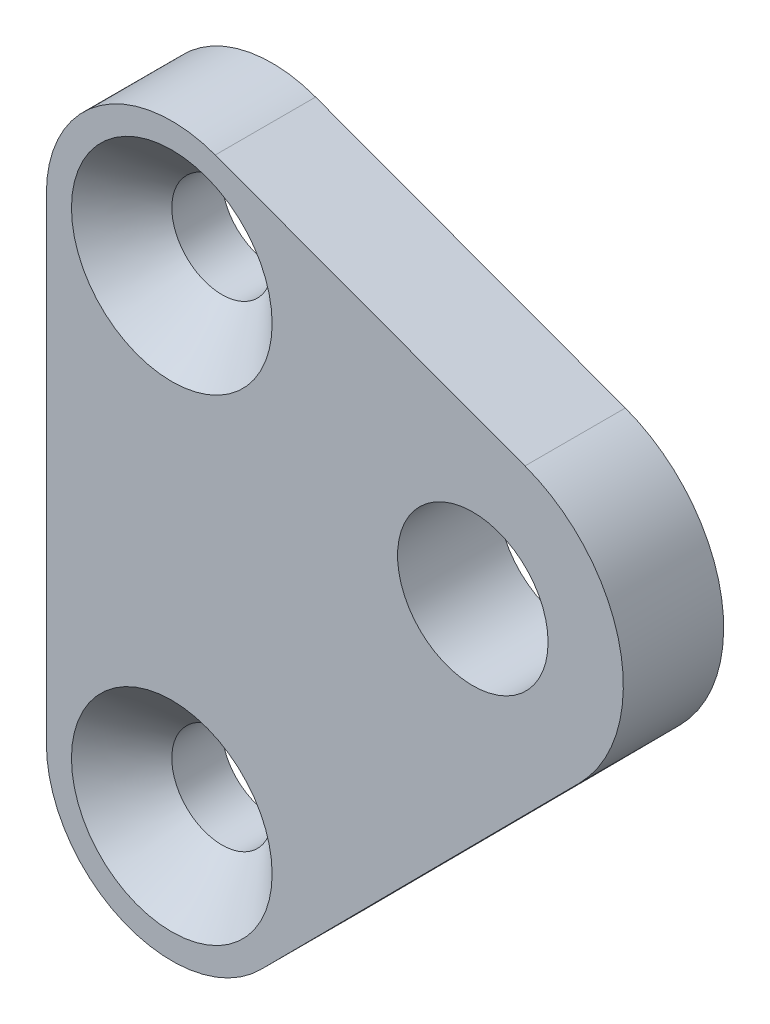
ISO-10303-21;
HEADER;
FILE_DESCRIPTION(('STEP AP214'),'2;1');
FILE_NAME('part.step','',(''),(''),'','','');
FILE_SCHEMA(('AUTOMOTIVE_DESIGN { 1 0 10303 214 1 1 1 1 }'));
ENDSEC;
DATA;
#1=APPLICATION_CONTEXT('core data for automotive mechanical design processes');
#2=APPLICATION_PROTOCOL_DEFINITION('international standard','automotive_design',2000,#1);
#3=PRODUCT_CONTEXT('',#1,'mechanical');
#4=PRODUCT('Part','Part','',(#3));
#5=PRODUCT_RELATED_PRODUCT_CATEGORY('part','',(#4));
#6=PRODUCT_DEFINITION_FORMATION('','',#4);
#7=PRODUCT_DEFINITION_CONTEXT('part definition',#1,'design');
#8=PRODUCT_DEFINITION('design','',#6,#7);
#9=PRODUCT_DEFINITION_SHAPE('','',#8);
#10=(LENGTH_UNIT() NAMED_UNIT(*) SI_UNIT(.MILLI.,.METRE.));
#11=(NAMED_UNIT(*) PLANE_ANGLE_UNIT() SI_UNIT($,.RADIAN.));
#12=(NAMED_UNIT(*) SI_UNIT($,.STERADIAN.) SOLID_ANGLE_UNIT());
#13=UNCERTAINTY_MEASURE_WITH_UNIT(LENGTH_MEASURE(1.E-05),#10,'distance_accuracy_value','');
#14=(GEOMETRIC_REPRESENTATION_CONTEXT(3) GLOBAL_UNCERTAINTY_ASSIGNED_CONTEXT((#13)) GLOBAL_UNIT_ASSIGNED_CONTEXT((#10,
#11,#12)) REPRESENTATION_CONTEXT('',''));
#15=CARTESIAN_POINT('',(0.,0.,0.));
#16=DIRECTION('',(0.,0.,1.));
#17=DIRECTION('',(1.,0.,0.));
#18=AXIS2_PLACEMENT_3D('',#15,#16,#17);
#19=CARTESIAN_POINT('',(18.,9.5,4.));
#20=DIRECTION('',(0.,0.,1.));
#21=DIRECTION('',(1.,0.,0.));
#22=AXIS2_PLACEMENT_3D('',#19,#20,#21);
#23=PLANE('',#22);
#24=CARTESIAN_POINT('',(18.,-9.5,4.));
#25=DIRECTION('',(0.,0.,1.));
#26=DIRECTION('',(1.,0.,0.));
#27=AXIS2_PLACEMENT_3D('',#24,#25,#26);
#28=CIRCLE('',#27,4.00000000000001);
#29=CARTESIAN_POINT('',(22.,-9.5,4.));
#30=VERTEX_POINT('',#29);
#31=EDGE_CURVE('E48',#30,#30,#28,.F.);
#32=ORIENTED_EDGE('',*,*,#31,.T.);
#33=EDGE_LOOP('',(#32));
#34=FACE_BOUND('',#33,.T.);
#35=CARTESIAN_POINT('',(18.,9.5,4.));
#36=DIRECTION('',(0.,0.,1.));
#37=DIRECTION('',(1.,0.,0.));
#38=AXIS2_PLACEMENT_3D('',#35,#36,#37);
#39=CIRCLE('',#38,4.);
#40=CARTESIAN_POINT('',(22.,9.5,4.));
#41=VERTEX_POINT('',#40);
#42=EDGE_CURVE('E148',#41,#41,#39,.F.);
#43=ORIENTED_EDGE('',*,*,#42,.T.);
#44=EDGE_LOOP('',(#43));
#45=FACE_BOUND('',#44,.T.);
#46=CARTESIAN_POINT('',(18.,9.5,4.));
#47=DIRECTION('',(0.,0.,1.));
#48=DIRECTION('',(1.,0.,0.));
#49=AXIS2_PLACEMENT_3D('',#46,#47,#48);
#50=CIRCLE('',#49,5.);
#51=CARTESIAN_POINT('',(19.7329542667428,14.1900820365296,4.));
#52=VERTEX_POINT('',#51);
#53=CARTESIAN_POINT('',(13.,9.5,4.));
#54=VERTEX_POINT('',#53);
#55=EDGE_CURVE('E136',#52,#54,#50,.T.);
#56=ORIENTED_EDGE('',*,*,#55,.T.);
#57=DIRECTION('',(0.,-1.,0.));
#58=VECTOR('',#57,1.);
#59=CARTESIAN_POINT('',(13.,9.5,4.));
#60=LINE('',#59,#58);
#61=CARTESIAN_POINT('',(13.,-9.5,4.));
#62=VERTEX_POINT('',#61);
#63=EDGE_CURVE('E94',#54,#62,#60,.T.);
#64=ORIENTED_EDGE('',*,*,#63,.T.);
#65=CARTESIAN_POINT('',(18.,-9.5,4.));
#66=DIRECTION('',(0.,0.,1.));
#67=DIRECTION('',(-1.,0.,0.));
#68=AXIS2_PLACEMENT_3D('',#65,#66,#67);
#69=CIRCLE('',#68,5.);
#70=CARTESIAN_POINT('',(21.5474068775136,-13.0236209281603,4.));
#71=VERTEX_POINT('',#70);
#72=EDGE_CURVE('E107',#62,#71,#69,.T.);
#73=ORIENTED_EDGE('',*,*,#72,.T.);
#74=DIRECTION('',(0.704724185632053,0.709481375502726,0.));
#75=VECTOR('',#74,1.);
#76=CARTESIAN_POINT('',(21.5474068775136,-13.0236209281603,4.));
#77=LINE('',#76,#75);
#78=CARTESIAN_POINT('',(34.2568882530164,-0.228345113792311,4.));
#79=VERTEX_POINT('',#78);
#80=EDGE_CURVE('E101',#71,#79,#77,.T.);
#81=ORIENTED_EDGE('',*,*,#80,.T.);
#82=CARTESIAN_POINT('',(30.,4.,4.));
#83=DIRECTION('',(0.,0.,1.));
#84=DIRECTION('',(-1.,0.,0.));
#85=AXIS2_PLACEMENT_3D('',#82,#83,#84);
#86=CIRCLE('',#85,6.);
#87=CARTESIAN_POINT('',(32.0795451200913,9.62809844383557,4.));
#88=VERTEX_POINT('',#87);
#89=EDGE_CURVE('E105',#79,#88,#86,.T.);
#90=ORIENTED_EDGE('',*,*,#89,.T.);
#91=DIRECTION('',(-0.938016407305929,0.346590853348552,0.));
#92=VECTOR('',#91,1.);
#93=CARTESIAN_POINT('',(19.7329542667428,14.1900820365296,4.));
#94=LINE('',#93,#92);
#95=EDGE_CURVE('E56',#88,#52,#94,.T.);
#96=ORIENTED_EDGE('',*,*,#95,.T.);
#97=EDGE_LOOP('',(#56,#64,#73,#81,#90,#96));
#98=FACE_BOUND('',#97,.T.);
#99=CARTESIAN_POINT('',(30.,4.,4.));
#100=DIRECTION('',(0.,0.,1.));
#101=DIRECTION('',(1.,0.,0.));
#102=AXIS2_PLACEMENT_3D('',#99,#100,#101);
#103=CIRCLE('',#102,3.00000000000001);
#104=CARTESIAN_POINT('',(33.,4.,4.));
#105=VERTEX_POINT('',#104);
#106=EDGE_CURVE('E170',#105,#105,#103,.T.);
#107=ORIENTED_EDGE('',*,*,#106,.F.);
#108=EDGE_LOOP('',(#107));
#109=FACE_BOUND('',#108,.T.);
#110=ADVANCED_FACE('F38',(#34,#45,#98,#109),#23,.T.);
#111=CARTESIAN_POINT('',(18.,9.5,0.));
#112=DIRECTION('',(0.,0.,1.));
#113=DIRECTION('',(1.,0.,0.));
#114=AXIS2_PLACEMENT_3D('',#111,#112,#113);
#115=PLANE('',#114);
#116=CARTESIAN_POINT('',(18.,9.5,0.));
#117=DIRECTION('',(0.,0.,1.));
#118=DIRECTION('',(1.,0.,0.));
#119=AXIS2_PLACEMENT_3D('',#116,#117,#118);
#120=CIRCLE('',#119,5.);
#121=CARTESIAN_POINT('',(19.7329542667428,14.1900820365296,0.));
#122=VERTEX_POINT('',#121);
#123=CARTESIAN_POINT('',(13.,9.5,0.));
#124=VERTEX_POINT('',#123);
#125=EDGE_CURVE('E125',#122,#124,#120,.T.);
#126=ORIENTED_EDGE('',*,*,#125,.F.);
#127=DIRECTION('',(-0.938016407305929,0.346590853348552,0.));
#128=VECTOR('',#127,1.);
#129=CARTESIAN_POINT('',(19.7329542667428,14.1900820365296,0.));
#130=LINE('',#129,#128);
#131=CARTESIAN_POINT('',(32.0795451200913,9.62809844383557,0.));
#132=VERTEX_POINT('',#131);
#133=EDGE_CURVE('E85',#132,#122,#130,.T.);
#134=ORIENTED_EDGE('',*,*,#133,.F.);
#135=CARTESIAN_POINT('',(30.,4.,0.));
#136=DIRECTION('',(0.,0.,1.));
#137=DIRECTION('',(-1.,0.,0.));
#138=AXIS2_PLACEMENT_3D('',#135,#136,#137);
#139=CIRCLE('',#138,6.);
#140=CARTESIAN_POINT('',(34.2568882530164,-0.228345113792311,0.));
#141=VERTEX_POINT('',#140);
#142=EDGE_CURVE('E79',#141,#132,#139,.T.);
#143=ORIENTED_EDGE('',*,*,#142,.F.);
#144=DIRECTION('',(0.704724185632053,0.709481375502726,0.));
#145=VECTOR('',#144,1.);
#146=CARTESIAN_POINT('',(21.5474068775136,-13.0236209281603,0.));
#147=LINE('',#146,#145);
#148=CARTESIAN_POINT('',(21.5474068775136,-13.0236209281603,0.));
#149=VERTEX_POINT('',#148);
#150=EDGE_CURVE('E115',#149,#141,#147,.T.);
#151=ORIENTED_EDGE('',*,*,#150,.F.);
#152=CARTESIAN_POINT('',(18.,-9.5,0.));
#153=DIRECTION('',(0.,0.,1.));
#154=DIRECTION('',(-1.,0.,0.));
#155=AXIS2_PLACEMENT_3D('',#152,#153,#154);
#156=CIRCLE('',#155,5.);
#157=CARTESIAN_POINT('',(13.,-9.5,0.));
#158=VERTEX_POINT('',#157);
#159=EDGE_CURVE('E131',#158,#149,#156,.T.);
#160=ORIENTED_EDGE('',*,*,#159,.F.);
#161=DIRECTION('',(0.,-1.,0.));
#162=VECTOR('',#161,1.);
#163=CARTESIAN_POINT('',(13.,9.5,0.));
#164=LINE('',#163,#162);
#165=EDGE_CURVE('E128',#124,#158,#164,.T.);
#166=ORIENTED_EDGE('',*,*,#165,.F.);
#167=EDGE_LOOP('',(#126,#134,#143,#151,#160,#166));
#168=FACE_BOUND('',#167,.T.);
#169=CARTESIAN_POINT('',(18.,9.5,0.));
#170=DIRECTION('',(0.,0.,1.));
#171=DIRECTION('',(1.,0.,0.));
#172=AXIS2_PLACEMENT_3D('',#169,#170,#171);
#173=CIRCLE('',#172,2.);
#174=CARTESIAN_POINT('',(20.,9.5,0.));
#175=VERTEX_POINT('',#174);
#176=EDGE_CURVE('E129',#175,#175,#173,.T.);
#177=ORIENTED_EDGE('',*,*,#176,.T.);
#178=EDGE_LOOP('',(#177));
#179=FACE_BOUND('',#178,.T.);
#180=CARTESIAN_POINT('',(18.,-9.5,0.));
#181=DIRECTION('',(0.,0.,1.));
#182=DIRECTION('',(1.,0.,0.));
#183=AXIS2_PLACEMENT_3D('',#180,#181,#182);
#184=CIRCLE('',#183,2.);
#185=CARTESIAN_POINT('',(20.,-9.5,0.));
#186=VERTEX_POINT('',#185);
#187=EDGE_CURVE('E168',#186,#186,#184,.T.);
#188=ORIENTED_EDGE('',*,*,#187,.T.);
#189=EDGE_LOOP('',(#188));
#190=FACE_BOUND('',#189,.T.);
#191=CARTESIAN_POINT('',(30.,4.,0.));
#192=DIRECTION('',(0.,0.,1.));
#193=DIRECTION('',(1.,0.,0.));
#194=AXIS2_PLACEMENT_3D('',#191,#192,#193);
#195=CIRCLE('',#194,3.00000000000001);
#196=CARTESIAN_POINT('',(33.,4.,0.));
#197=VERTEX_POINT('',#196);
#198=EDGE_CURVE('E175',#197,#197,#195,.T.);
#199=ORIENTED_EDGE('',*,*,#198,.T.);
#200=EDGE_LOOP('',(#199));
#201=FACE_BOUND('',#200,.T.);
#202=ADVANCED_FACE('F188',(#168,#179,#190,#201),#115,.F.);
#203=CARTESIAN_POINT('',(18.,9.5,4.));
#204=DIRECTION('',(0.,0.,-1.));
#205=DIRECTION('',(-1.,0.,0.));
#206=AXIS2_PLACEMENT_3D('',#203,#204,#205);
#207=CYLINDRICAL_SURFACE('',#206,5.);
#208=ORIENTED_EDGE('',*,*,#125,.T.);
#209=DIRECTION('',(0.,0.,-1.));
#210=VECTOR('',#209,1.);
#211=CARTESIAN_POINT('',(13.,9.5,4.));
#212=LINE('',#211,#210);
#213=EDGE_CURVE('E143',#54,#124,#212,.T.);
#214=ORIENTED_EDGE('',*,*,#213,.F.);
#215=ORIENTED_EDGE('',*,*,#55,.F.);
#216=DIRECTION('',(0.,0.,-1.));
#217=VECTOR('',#216,1.);
#218=CARTESIAN_POINT('',(19.7329542667428,14.1900820365296,4.));
#219=LINE('',#218,#217);
#220=EDGE_CURVE('E121',#52,#122,#219,.T.);
#221=ORIENTED_EDGE('',*,*,#220,.T.);
#222=EDGE_LOOP('',(#208,#214,#215,#221));
#223=FACE_BOUND('',#222,.T.);
#224=ADVANCED_FACE('F191',(#223),#207,.T.);
#225=CARTESIAN_POINT('',(13.,9.5,4.));
#226=DIRECTION('',(1.,0.,0.));
#227=DIRECTION('',(0.,1.,0.));
#228=AXIS2_PLACEMENT_3D('',#225,#226,#227);
#229=PLANE('',#228);
#230=ORIENTED_EDGE('',*,*,#165,.T.);
#231=DIRECTION('',(0.,0.,-1.));
#232=VECTOR('',#231,1.);
#233=CARTESIAN_POINT('',(13.,-9.5,4.));
#234=LINE('',#233,#232);
#235=EDGE_CURVE('E140',#62,#158,#234,.T.);
#236=ORIENTED_EDGE('',*,*,#235,.F.);
#237=ORIENTED_EDGE('',*,*,#63,.F.);
#238=ORIENTED_EDGE('',*,*,#213,.T.);
#239=EDGE_LOOP('',(#230,#236,#237,#238));
#240=FACE_BOUND('',#239,.T.);
#241=ADVANCED_FACE('F182',(#240),#229,.F.);
#242=CARTESIAN_POINT('',(18.,-9.5,4.));
#243=DIRECTION('',(0.,0.,-1.));
#244=DIRECTION('',(-1.,0.,0.));
#245=AXIS2_PLACEMENT_3D('',#242,#243,#244);
#246=CYLINDRICAL_SURFACE('',#245,5.);
#247=ORIENTED_EDGE('',*,*,#159,.T.);
#248=DIRECTION('',(0.,0.,-1.));
#249=VECTOR('',#248,1.);
#250=CARTESIAN_POINT('',(21.5474068775136,-13.0236209281603,4.));
#251=LINE('',#250,#249);
#252=EDGE_CURVE('E116',#71,#149,#251,.T.);
#253=ORIENTED_EDGE('',*,*,#252,.F.);
#254=ORIENTED_EDGE('',*,*,#72,.F.);
#255=ORIENTED_EDGE('',*,*,#235,.T.);
#256=EDGE_LOOP('',(#247,#253,#254,#255));
#257=FACE_BOUND('',#256,.T.);
#258=ADVANCED_FACE('F185',(#257),#246,.T.);
#259=CARTESIAN_POINT('',(21.5474068775136,-13.0236209281603,4.));
#260=DIRECTION('',(-0.709481375502726,0.704724185632053,0.));
#261=DIRECTION('',(-0.704724185632053,-0.709481375502726,0.));
#262=AXIS2_PLACEMENT_3D('',#259,#260,#261);
#263=PLANE('',#262);
#264=ORIENTED_EDGE('',*,*,#150,.T.);
#265=DIRECTION('',(0.,0.,-1.));
#266=VECTOR('',#265,1.);
#267=CARTESIAN_POINT('',(34.2568882530164,-0.228345113792311,4.));
#268=LINE('',#267,#266);
#269=EDGE_CURVE('E112',#79,#141,#268,.T.);
#270=ORIENTED_EDGE('',*,*,#269,.F.);
#271=ORIENTED_EDGE('',*,*,#80,.F.);
#272=ORIENTED_EDGE('',*,*,#252,.T.);
#273=EDGE_LOOP('',(#264,#270,#271,#272));
#274=FACE_BOUND('',#273,.T.);
#275=ADVANCED_FACE('F113',(#274),#263,.F.);
#276=CARTESIAN_POINT('',(30.,4.,4.));
#277=DIRECTION('',(0.,0.,-1.));
#278=DIRECTION('',(-1.,0.,0.));
#279=AXIS2_PLACEMENT_3D('',#276,#277,#278);
#280=CYLINDRICAL_SURFACE('',#279,6.);
#281=ORIENTED_EDGE('',*,*,#142,.T.);
#282=DIRECTION('',(0.,0.,-1.));
#283=VECTOR('',#282,1.);
#284=CARTESIAN_POINT('',(32.0795451200913,9.62809844383557,4.));
#285=LINE('',#284,#283);
#286=EDGE_CURVE('E117',#88,#132,#285,.T.);
#287=ORIENTED_EDGE('',*,*,#286,.F.);
#288=ORIENTED_EDGE('',*,*,#89,.F.);
#289=ORIENTED_EDGE('',*,*,#269,.T.);
#290=EDGE_LOOP('',(#281,#287,#288,#289));
#291=FACE_BOUND('',#290,.T.);
#292=ADVANCED_FACE('F119',(#291),#280,.T.);
#293=CARTESIAN_POINT('',(19.7329542667428,14.1900820365296,4.));
#294=DIRECTION('',(-0.346590853348552,-0.938016407305929,0.));
#295=DIRECTION('',(0.938016407305929,-0.346590853348552,0.));
#296=AXIS2_PLACEMENT_3D('',#293,#294,#295);
#297=PLANE('',#296);
#298=ORIENTED_EDGE('',*,*,#133,.T.);
#299=ORIENTED_EDGE('',*,*,#220,.F.);
#300=ORIENTED_EDGE('',*,*,#95,.F.);
#301=ORIENTED_EDGE('',*,*,#286,.T.);
#302=EDGE_LOOP('',(#298,#299,#300,#301));
#303=FACE_BOUND('',#302,.T.);
#304=ADVANCED_FACE('F192',(#303),#297,.F.);
#305=CARTESIAN_POINT('',(18.,9.5,4.));
#306=DIRECTION('',(0.,0.,-1.));
#307=DIRECTION('',(-1.,0.,0.));
#308=AXIS2_PLACEMENT_3D('',#305,#306,#307);
#309=CYLINDRICAL_SURFACE('',#308,2.);
#310=CARTESIAN_POINT('',(18.,9.5,2.));
#311=DIRECTION('',(0.,0.,1.));
#312=DIRECTION('',(1.,0.,0.));
#313=AXIS2_PLACEMENT_3D('',#310,#311,#312);
#314=CIRCLE('',#313,2.);
#315=CARTESIAN_POINT('',(20.,9.5,2.));
#316=VERTEX_POINT('',#315);
#317=EDGE_CURVE('E11',#316,#316,#314,.T.);
#318=ORIENTED_EDGE('',*,*,#317,.T.);
#319=EDGE_LOOP('',(#318));
#320=FACE_BOUND('',#319,.T.);
#321=ORIENTED_EDGE('',*,*,#176,.F.);
#322=EDGE_LOOP('',(#321));
#323=FACE_BOUND('',#322,.T.);
#324=ADVANCED_FACE('F164',(#320,#323),#309,.F.);
#325=CARTESIAN_POINT('',(18.,-9.5,4.));
#326=DIRECTION('',(0.,0.,-1.));
#327=DIRECTION('',(-1.,0.,0.));
#328=AXIS2_PLACEMENT_3D('',#325,#326,#327);
#329=CYLINDRICAL_SURFACE('',#328,2.);
#330=CARTESIAN_POINT('',(18.,-9.5,2.));
#331=DIRECTION('',(0.,0.,1.));
#332=DIRECTION('',(1.,0.,0.));
#333=AXIS2_PLACEMENT_3D('',#330,#331,#332);
#334=CIRCLE('',#333,2.);
#335=CARTESIAN_POINT('',(20.,-9.5,2.));
#336=VERTEX_POINT('',#335);
#337=EDGE_CURVE('E145',#336,#336,#334,.T.);
#338=ORIENTED_EDGE('',*,*,#337,.T.);
#339=EDGE_LOOP('',(#338));
#340=FACE_BOUND('',#339,.T.);
#341=ORIENTED_EDGE('',*,*,#187,.F.);
#342=EDGE_LOOP('',(#341));
#343=FACE_BOUND('',#342,.T.);
#344=ADVANCED_FACE('F161',(#340,#343),#329,.F.);
#345=CARTESIAN_POINT('',(30.,4.,4.));
#346=DIRECTION('',(0.,0.,-1.));
#347=DIRECTION('',(-1.,0.,0.));
#348=AXIS2_PLACEMENT_3D('',#345,#346,#347);
#349=CYLINDRICAL_SURFACE('',#348,3.00000000000001);
#350=ORIENTED_EDGE('',*,*,#106,.T.);
#351=EDGE_LOOP('',(#350));
#352=FACE_BOUND('',#351,.T.);
#353=ORIENTED_EDGE('',*,*,#198,.F.);
#354=EDGE_LOOP('',(#353));
#355=FACE_BOUND('',#354,.T.);
#356=ADVANCED_FACE('F158',(#352,#355),#349,.F.);
#357=CARTESIAN_POINT('',(18.,-9.5,2.));
#358=DIRECTION('',(0.,0.,1.));
#359=DIRECTION('',(1.,0.,0.));
#360=AXIS2_PLACEMENT_3D('',#357,#358,#359);
#361=CONICAL_SURFACE('',#360,2.,0.78539816339745);
#362=ORIENTED_EDGE('',*,*,#31,.F.);
#363=EDGE_LOOP('',(#362));
#364=FACE_BOUND('',#363,.T.);
#365=ORIENTED_EDGE('',*,*,#337,.F.);
#366=EDGE_LOOP('',(#365));
#367=FACE_BOUND('',#366,.T.);
#368=ADVANCED_FACE('F155',(#364,#367),#361,.F.);
#369=CARTESIAN_POINT('',(18.,9.5,2.));
#370=DIRECTION('',(0.,0.,1.));
#371=DIRECTION('',(1.,0.,0.));
#372=AXIS2_PLACEMENT_3D('',#369,#370,#371);
#373=CONICAL_SURFACE('',#372,2.,0.785398163397449);
#374=ORIENTED_EDGE('',*,*,#42,.F.);
#375=EDGE_LOOP('',(#374));
#376=FACE_BOUND('',#375,.T.);
#377=ORIENTED_EDGE('',*,*,#317,.F.);
#378=EDGE_LOOP('',(#377));
#379=FACE_BOUND('',#378,.T.);
#380=ADVANCED_FACE('F41',(#376,#379),#373,.F.);
#381=CLOSED_SHELL('',(#110,#202,#224,#241,#258,#275,#292,#304,#324,#344,#356,#368,#380));
#382=MANIFOLD_SOLID_BREP('B2',#381);
#383=ADVANCED_BREP_SHAPE_REPRESENTATION('',(#18,#382),#14);
#384=SHAPE_DEFINITION_REPRESENTATION(#9,#383);
ENDSEC;
END-ISO-10303-21;
